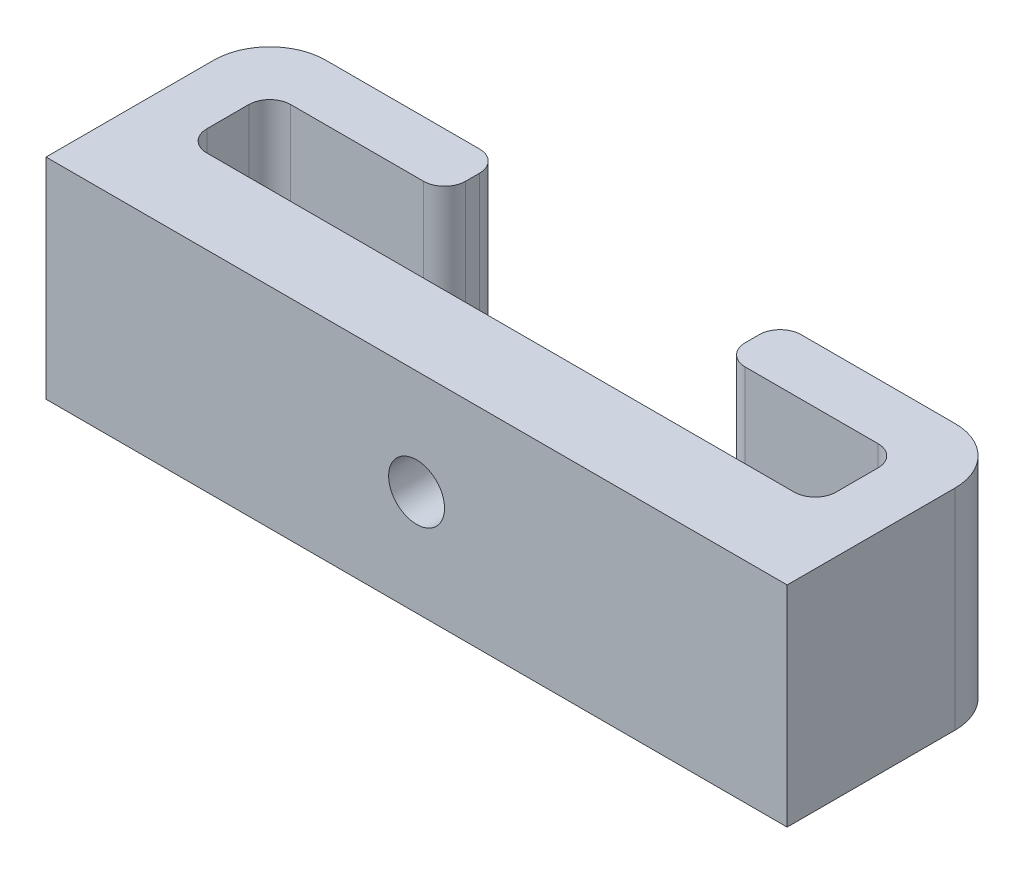
ISO-10303-21;
HEADER;
FILE_DESCRIPTION(('STEP AP214'),'2;1');
FILE_NAME('part.step','',(''),(''),'','','');
FILE_SCHEMA(('AUTOMOTIVE_DESIGN { 1 0 10303 214 1 1 1 1 }'));
ENDSEC;
DATA;
#1=APPLICATION_CONTEXT('core data for automotive mechanical design processes');
#2=APPLICATION_PROTOCOL_DEFINITION('international standard','automotive_design',2000,#1);
#3=PRODUCT_CONTEXT('',#1,'mechanical');
#4=PRODUCT('Part','Part','',(#3));
#5=PRODUCT_RELATED_PRODUCT_CATEGORY('part','',(#4));
#6=PRODUCT_DEFINITION_FORMATION('','',#4);
#7=PRODUCT_DEFINITION_CONTEXT('part definition',#1,'design');
#8=PRODUCT_DEFINITION('design','',#6,#7);
#9=PRODUCT_DEFINITION_SHAPE('','',#8);
#10=(LENGTH_UNIT() NAMED_UNIT(*) SI_UNIT(.MILLI.,.METRE.));
#11=(NAMED_UNIT(*) PLANE_ANGLE_UNIT() SI_UNIT($,.RADIAN.));
#12=(NAMED_UNIT(*) SI_UNIT($,.STERADIAN.) SOLID_ANGLE_UNIT());
#13=UNCERTAINTY_MEASURE_WITH_UNIT(LENGTH_MEASURE(1.E-05),#10,'distance_accuracy_value','');
#14=(GEOMETRIC_REPRESENTATION_CONTEXT(3) GLOBAL_UNCERTAINTY_ASSIGNED_CONTEXT((#13)) GLOBAL_UNIT_ASSIGNED_CONTEXT((#10,
#11,#12)) REPRESENTATION_CONTEXT('',''));
#15=CARTESIAN_POINT('',(0.,0.,0.));
#16=DIRECTION('',(0.,0.,1.));
#17=DIRECTION('',(1.,0.,0.));
#18=AXIS2_PLACEMENT_3D('',#15,#16,#17);
#19=CARTESIAN_POINT('',(-10.,7.5,-6.));
#20=DIRECTION('',(0.,0.,-1.));
#21=DIRECTION('',(-1.,0.,0.));
#22=AXIS2_PLACEMENT_3D('',#19,#20,#21);
#23=PLANE('',#22);
#24=DIRECTION('',(1.,0.,0.));
#25=VECTOR('',#24,1.);
#26=CARTESIAN_POINT('',(-10.,-7.5,-6.));
#27=LINE('',#26,#25);
#28=CARTESIAN_POINT('',(-21.,-7.5,-6.));
#29=VERTEX_POINT('',#28);
#30=CARTESIAN_POINT('',(-11.5,-7.5,-6.));
#31=VERTEX_POINT('',#30);
#32=EDGE_CURVE('E216',#29,#31,#27,.T.);
#33=ORIENTED_EDGE('',*,*,#32,.T.);
#34=DIRECTION('',(0.,-1.,0.));
#35=VECTOR('',#34,1.);
#36=CARTESIAN_POINT('',(-11.5,7.5,-6.));
#37=LINE('',#36,#35);
#38=CARTESIAN_POINT('',(-11.5,7.5,-6.));
#39=VERTEX_POINT('',#38);
#40=EDGE_CURVE('E321',#31,#39,#37,.F.);
#41=ORIENTED_EDGE('',*,*,#40,.T.);
#42=DIRECTION('',(1.,0.,0.));
#43=VECTOR('',#42,1.);
#44=CARTESIAN_POINT('',(-10.,7.5,-6.));
#45=LINE('',#44,#43);
#46=CARTESIAN_POINT('',(-21.,7.5,-6.));
#47=VERTEX_POINT('',#46);
#48=EDGE_CURVE('E217',#47,#39,#45,.T.);
#49=ORIENTED_EDGE('',*,*,#48,.F.);
#50=DIRECTION('',(0.,-1.,0.));
#51=VECTOR('',#50,1.);
#52=CARTESIAN_POINT('',(-21.,-7.5,-6.));
#53=LINE('',#52,#51);
#54=EDGE_CURVE('E318',#47,#29,#53,.T.);
#55=ORIENTED_EDGE('',*,*,#54,.T.);
#56=EDGE_LOOP('',(#33,#41,#49,#55));
#57=FACE_BOUND('',#56,.T.);
#58=ADVANCED_FACE('F33',(#57),#23,.F.);
#59=CARTESIAN_POINT('',(-10.,7.5,-10.));
#60=DIRECTION('',(1.,0.,0.));
#61=DIRECTION('',(0.,0.,-1.));
#62=AXIS2_PLACEMENT_3D('',#59,#60,#61);
#63=PLANE('',#62);
#64=DIRECTION('',(0.,0.,1.));
#65=VECTOR('',#64,1.);
#66=CARTESIAN_POINT('',(-10.,-7.5,-10.));
#67=LINE('',#66,#65);
#68=CARTESIAN_POINT('',(-10.,-7.5,-8.5));
#69=VERTEX_POINT('',#68);
#70=CARTESIAN_POINT('',(-10.,-7.5,-7.5));
#71=VERTEX_POINT('',#70);
#72=EDGE_CURVE('E250',#69,#71,#67,.T.);
#73=ORIENTED_EDGE('',*,*,#72,.F.);
#74=DIRECTION('',(0.,-1.,0.));
#75=VECTOR('',#74,1.);
#76=CARTESIAN_POINT('',(-10.,7.5,-8.5));
#77=LINE('',#76,#75);
#78=CARTESIAN_POINT('',(-10.,7.5,-8.5));
#79=VERTEX_POINT('',#78);
#80=EDGE_CURVE('E316',#69,#79,#77,.F.);
#81=ORIENTED_EDGE('',*,*,#80,.T.);
#82=DIRECTION('',(0.,0.,1.));
#83=VECTOR('',#82,1.);
#84=CARTESIAN_POINT('',(-10.,7.5,-10.));
#85=LINE('',#84,#83);
#86=CARTESIAN_POINT('',(-10.,7.5,-7.5));
#87=VERTEX_POINT('',#86);
#88=EDGE_CURVE('E220',#79,#87,#85,.T.);
#89=ORIENTED_EDGE('',*,*,#88,.T.);
#90=DIRECTION('',(0.,-1.,0.));
#91=VECTOR('',#90,1.);
#92=CARTESIAN_POINT('',(-10.,-7.5,-7.5));
#93=LINE('',#92,#91);
#94=EDGE_CURVE('E313',#87,#71,#93,.T.);
#95=ORIENTED_EDGE('',*,*,#94,.T.);
#96=EDGE_LOOP('',(#73,#81,#89,#95));
#97=FACE_BOUND('',#96,.T.);
#98=ADVANCED_FACE('F421',(#97),#63,.T.);
#99=CARTESIAN_POINT('',(-10.,7.5,-10.));
#100=DIRECTION('',(0.,0.,-1.));
#101=DIRECTION('',(-1.,0.,0.));
#102=AXIS2_PLACEMENT_3D('',#99,#100,#101);
#103=PLANE('',#102);
#104=DIRECTION('',(1.,0.,0.));
#105=VECTOR('',#104,1.);
#106=CARTESIAN_POINT('',(-10.,-7.5,-10.));
#107=LINE('',#106,#105);
#108=CARTESIAN_POINT('',(-22.5,-7.5,-10.));
#109=VERTEX_POINT('',#108);
#110=CARTESIAN_POINT('',(-11.5,-7.5,-10.));
#111=VERTEX_POINT('',#110);
#112=EDGE_CURVE('E193',#109,#111,#107,.T.);
#113=ORIENTED_EDGE('',*,*,#112,.F.);
#114=DIRECTION('',(0.,-1.,0.));
#115=VECTOR('',#114,1.);
#116=CARTESIAN_POINT('',(-22.5,7.5,-10.));
#117=LINE('',#116,#115);
#118=CARTESIAN_POINT('',(-22.5,7.5,-10.));
#119=VERTEX_POINT('',#118);
#120=EDGE_CURVE('E349',#109,#119,#117,.F.);
#121=ORIENTED_EDGE('',*,*,#120,.T.);
#122=DIRECTION('',(1.,0.,0.));
#123=VECTOR('',#122,1.);
#124=CARTESIAN_POINT('',(-10.,7.5,-10.));
#125=LINE('',#124,#123);
#126=CARTESIAN_POINT('',(-11.5,7.5,-10.));
#127=VERTEX_POINT('',#126);
#128=EDGE_CURVE('E224',#119,#127,#125,.T.);
#129=ORIENTED_EDGE('',*,*,#128,.T.);
#130=DIRECTION('',(0.,-1.,0.));
#131=VECTOR('',#130,1.);
#132=CARTESIAN_POINT('',(-11.5,7.5,-10.));
#133=LINE('',#132,#131);
#134=EDGE_CURVE('E310',#127,#111,#133,.T.);
#135=ORIENTED_EDGE('',*,*,#134,.T.);
#136=EDGE_LOOP('',(#113,#121,#129,#135));
#137=FACE_BOUND('',#136,.T.);
#138=ADVANCED_FACE('F431',(#137),#103,.T.);
#139=CARTESIAN_POINT('',(-26.5,7.5,-6.));
#140=DIRECTION('',(-1.,0.,0.));
#141=DIRECTION('',(0.,0.,1.));
#142=AXIS2_PLACEMENT_3D('',#139,#140,#141);
#143=PLANE('',#142);
#144=DIRECTION('',(0.,0.,-1.));
#145=VECTOR('',#144,1.);
#146=CARTESIAN_POINT('',(-26.5,7.5,-6.));
#147=LINE('',#146,#145);
#148=CARTESIAN_POINT('',(-26.5,7.5,6.));
#149=VERTEX_POINT('',#148);
#150=CARTESIAN_POINT('',(-26.5,7.5,-6.));
#151=VERTEX_POINT('',#150);
#152=EDGE_CURVE('E226',#149,#151,#147,.T.);
#153=ORIENTED_EDGE('',*,*,#152,.T.);
#154=DIRECTION('',(0.,-1.,0.));
#155=VECTOR('',#154,1.);
#156=CARTESIAN_POINT('',(-26.5,7.5,-6.));
#157=LINE('',#156,#155);
#158=CARTESIAN_POINT('',(-26.5,-7.5,-6.));
#159=VERTEX_POINT('',#158);
#160=EDGE_CURVE('E190',#151,#159,#157,.T.);
#161=ORIENTED_EDGE('',*,*,#160,.T.);
#162=DIRECTION('',(0.,0.,-1.));
#163=VECTOR('',#162,1.);
#164=CARTESIAN_POINT('',(-26.5,-7.5,-6.));
#165=LINE('',#164,#163);
#166=CARTESIAN_POINT('',(-26.5,-7.5,6.));
#167=VERTEX_POINT('',#166);
#168=EDGE_CURVE('E183',#167,#159,#165,.T.);
#169=ORIENTED_EDGE('',*,*,#168,.F.);
#170=DIRECTION('',(0.,-1.,0.));
#171=VECTOR('',#170,1.);
#172=CARTESIAN_POINT('',(-26.5,7.5,6.));
#173=LINE('',#172,#171);
#174=EDGE_CURVE('E188',#149,#167,#173,.T.);
#175=ORIENTED_EDGE('',*,*,#174,.F.);
#176=EDGE_LOOP('',(#153,#161,#169,#175));
#177=FACE_BOUND('',#176,.T.);
#178=ADVANCED_FACE('F186',(#177),#143,.T.);
#179=CARTESIAN_POINT('',(26.5,7.5,-6.));
#180=DIRECTION('',(1.,0.,0.));
#181=DIRECTION('',(0.,0.,-1.));
#182=AXIS2_PLACEMENT_3D('',#179,#180,#181);
#183=PLANE('',#182);
#184=DIRECTION('',(0.,0.,-1.));
#185=VECTOR('',#184,1.);
#186=CARTESIAN_POINT('',(26.5,-7.5,-6.));
#187=LINE('',#186,#185);
#188=CARTESIAN_POINT('',(26.5,-7.5,-6.));
#189=VERTEX_POINT('',#188);
#190=CARTESIAN_POINT('',(26.5,-7.5,6.));
#191=VERTEX_POINT('',#190);
#192=EDGE_CURVE('E192',#189,#191,#187,.F.);
#193=ORIENTED_EDGE('',*,*,#192,.F.);
#194=DIRECTION('',(0.,-1.,0.));
#195=VECTOR('',#194,1.);
#196=CARTESIAN_POINT('',(26.5,7.5,-6.));
#197=LINE('',#196,#195);
#198=CARTESIAN_POINT('',(26.5,7.5,-6.));
#199=VERTEX_POINT('',#198);
#200=EDGE_CURVE('E11',#189,#199,#197,.F.);
#201=ORIENTED_EDGE('',*,*,#200,.T.);
#202=DIRECTION('',(0.,0.,-1.));
#203=VECTOR('',#202,1.);
#204=CARTESIAN_POINT('',(26.5,7.5,-6.));
#205=LINE('',#204,#203);
#206=CARTESIAN_POINT('',(26.5,7.5,6.));
#207=VERTEX_POINT('',#206);
#208=EDGE_CURVE('E228',#199,#207,#205,.F.);
#209=ORIENTED_EDGE('',*,*,#208,.T.);
#210=DIRECTION('',(0.,1.,0.));
#211=VECTOR('',#210,1.);
#212=CARTESIAN_POINT('',(26.5,-7.5,6.));
#213=LINE('',#212,#211);
#214=EDGE_CURVE('E201',#191,#207,#213,.T.);
#215=ORIENTED_EDGE('',*,*,#214,.F.);
#216=EDGE_LOOP('',(#193,#201,#209,#215));
#217=FACE_BOUND('',#216,.T.);
#218=ADVANCED_FACE('F491',(#217),#183,.T.);
#219=CARTESIAN_POINT('',(10.,7.5,-10.));
#220=DIRECTION('',(0.,0.,-1.));
#221=DIRECTION('',(-1.,0.,0.));
#222=AXIS2_PLACEMENT_3D('',#219,#220,#221);
#223=PLANE('',#222);
#224=DIRECTION('',(1.,0.,0.));
#225=VECTOR('',#224,1.);
#226=CARTESIAN_POINT('',(10.,7.5,-10.));
#227=LINE('',#226,#225);
#228=CARTESIAN_POINT('',(11.5,7.5,-10.));
#229=VERTEX_POINT('',#228);
#230=CARTESIAN_POINT('',(22.5,7.5,-10.));
#231=VERTEX_POINT('',#230);
#232=EDGE_CURVE('E230',#229,#231,#227,.T.);
#233=ORIENTED_EDGE('',*,*,#232,.T.);
#234=DIRECTION('',(0.,-1.,0.));
#235=VECTOR('',#234,1.);
#236=CARTESIAN_POINT('',(22.5,7.5,-10.));
#237=LINE('',#236,#235);
#238=CARTESIAN_POINT('',(22.5,-7.5,-10.));
#239=VERTEX_POINT('',#238);
#240=EDGE_CURVE('E41',#231,#239,#237,.T.);
#241=ORIENTED_EDGE('',*,*,#240,.T.);
#242=DIRECTION('',(1.,0.,0.));
#243=VECTOR('',#242,1.);
#244=CARTESIAN_POINT('',(10.,-7.5,-10.));
#245=LINE('',#244,#243);
#246=CARTESIAN_POINT('',(11.5,-7.5,-10.));
#247=VERTEX_POINT('',#246);
#248=EDGE_CURVE('E255',#247,#239,#245,.T.);
#249=ORIENTED_EDGE('',*,*,#248,.F.);
#250=DIRECTION('',(0.,-1.,0.));
#251=VECTOR('',#250,1.);
#252=CARTESIAN_POINT('',(11.5,7.5,-10.));
#253=LINE('',#252,#251);
#254=EDGE_CURVE('E284',#247,#229,#253,.F.);
#255=ORIENTED_EDGE('',*,*,#254,.T.);
#256=EDGE_LOOP('',(#233,#241,#249,#255));
#257=FACE_BOUND('',#256,.T.);
#258=ADVANCED_FACE('F357',(#257),#223,.T.);
#259=CARTESIAN_POINT('',(10.,7.5,-6.));
#260=DIRECTION('',(-1.,0.,0.));
#261=DIRECTION('',(0.,0.,1.));
#262=AXIS2_PLACEMENT_3D('',#259,#260,#261);
#263=PLANE('',#262);
#264=DIRECTION('',(0.,0.,-1.));
#265=VECTOR('',#264,1.);
#266=CARTESIAN_POINT('',(10.,7.5,-6.));
#267=LINE('',#266,#265);
#268=CARTESIAN_POINT('',(10.,7.5,-7.5));
#269=VERTEX_POINT('',#268);
#270=CARTESIAN_POINT('',(10.,7.5,-8.5));
#271=VERTEX_POINT('',#270);
#272=EDGE_CURVE('E232',#269,#271,#267,.T.);
#273=ORIENTED_EDGE('',*,*,#272,.T.);
#274=DIRECTION('',(0.,-1.,0.));
#275=VECTOR('',#274,1.);
#276=CARTESIAN_POINT('',(10.,7.5,-8.5));
#277=LINE('',#276,#275);
#278=CARTESIAN_POINT('',(10.,-7.5,-8.5));
#279=VERTEX_POINT('',#278);
#280=EDGE_CURVE('E273',#271,#279,#277,.T.);
#281=ORIENTED_EDGE('',*,*,#280,.T.);
#282=DIRECTION('',(0.,0.,-1.));
#283=VECTOR('',#282,1.);
#284=CARTESIAN_POINT('',(10.,-7.5,-6.));
#285=LINE('',#284,#283);
#286=CARTESIAN_POINT('',(10.,-7.5,-7.5));
#287=VERTEX_POINT('',#286);
#288=EDGE_CURVE('E258',#287,#279,#285,.T.);
#289=ORIENTED_EDGE('',*,*,#288,.F.);
#290=DIRECTION('',(0.,-1.,0.));
#291=VECTOR('',#290,1.);
#292=CARTESIAN_POINT('',(10.,7.5,-7.5));
#293=LINE('',#292,#291);
#294=EDGE_CURVE('E247',#287,#269,#293,.F.);
#295=ORIENTED_EDGE('',*,*,#294,.T.);
#296=EDGE_LOOP('',(#273,#281,#289,#295));
#297=FACE_BOUND('',#296,.T.);
#298=ADVANCED_FACE('F366',(#297),#263,.T.);
#299=CARTESIAN_POINT('',(10.,7.5,-6.));
#300=DIRECTION('',(0.,0.,-1.));
#301=DIRECTION('',(-1.,0.,0.));
#302=AXIS2_PLACEMENT_3D('',#299,#300,#301);
#303=PLANE('',#302);
#304=DIRECTION('',(1.,0.,0.));
#305=VECTOR('',#304,1.);
#306=CARTESIAN_POINT('',(10.,-7.5,-6.));
#307=LINE('',#306,#305);
#308=CARTESIAN_POINT('',(11.5,-7.5,-6.));
#309=VERTEX_POINT('',#308);
#310=CARTESIAN_POINT('',(21.,-7.5,-6.));
#311=VERTEX_POINT('',#310);
#312=EDGE_CURVE('E261',#309,#311,#307,.T.);
#313=ORIENTED_EDGE('',*,*,#312,.T.);
#314=DIRECTION('',(0.,-1.,0.));
#315=VECTOR('',#314,1.);
#316=CARTESIAN_POINT('',(21.,7.5,-6.));
#317=LINE('',#316,#315);
#318=CARTESIAN_POINT('',(21.,7.5,-6.));
#319=VERTEX_POINT('',#318);
#320=EDGE_CURVE('E303',#311,#319,#317,.F.);
#321=ORIENTED_EDGE('',*,*,#320,.T.);
#322=DIRECTION('',(1.,0.,0.));
#323=VECTOR('',#322,1.);
#324=CARTESIAN_POINT('',(10.,7.5,-6.));
#325=LINE('',#324,#323);
#326=CARTESIAN_POINT('',(11.5,7.5,-6.));
#327=VERTEX_POINT('',#326);
#328=EDGE_CURVE('E235',#327,#319,#325,.T.);
#329=ORIENTED_EDGE('',*,*,#328,.F.);
#330=DIRECTION('',(0.,-1.,0.));
#331=VECTOR('',#330,1.);
#332=CARTESIAN_POINT('',(11.5,-7.5,-6.));
#333=LINE('',#332,#331);
#334=EDGE_CURVE('E300',#327,#309,#333,.T.);
#335=ORIENTED_EDGE('',*,*,#334,.T.);
#336=EDGE_LOOP('',(#313,#321,#329,#335));
#337=FACE_BOUND('',#336,.T.);
#338=ADVANCED_FACE('F378',(#337),#303,.F.);
#339=CARTESIAN_POINT('',(22.5,7.5,-6.));
#340=DIRECTION('',(1.,0.,0.));
#341=DIRECTION('',(0.,0.,-1.));
#342=AXIS2_PLACEMENT_3D('',#339,#340,#341);
#343=PLANE('',#342);
#344=DIRECTION('',(0.,0.,1.));
#345=VECTOR('',#344,1.);
#346=CARTESIAN_POINT('',(22.5,7.5,-6.));
#347=LINE('',#346,#345);
#348=CARTESIAN_POINT('',(22.5,7.5,-4.5));
#349=VERTEX_POINT('',#348);
#350=CARTESIAN_POINT('',(22.5,7.5,-1.5));
#351=VERTEX_POINT('',#350);
#352=EDGE_CURVE('E238',#349,#351,#347,.T.);
#353=ORIENTED_EDGE('',*,*,#352,.F.);
#354=DIRECTION('',(0.,-1.,0.));
#355=VECTOR('',#354,1.);
#356=CARTESIAN_POINT('',(22.5,-7.5,-4.5));
#357=LINE('',#356,#355);
#358=CARTESIAN_POINT('',(22.5,-7.5,-4.5));
#359=VERTEX_POINT('',#358);
#360=EDGE_CURVE('E297',#349,#359,#357,.T.);
#361=ORIENTED_EDGE('',*,*,#360,.T.);
#362=DIRECTION('',(0.,0.,1.));
#363=VECTOR('',#362,1.);
#364=CARTESIAN_POINT('',(22.5,-7.5,-6.));
#365=LINE('',#364,#363);
#366=CARTESIAN_POINT('',(22.5,-7.5,-1.5));
#367=VERTEX_POINT('',#366);
#368=EDGE_CURVE('E264',#359,#367,#365,.T.);
#369=ORIENTED_EDGE('',*,*,#368,.T.);
#370=DIRECTION('',(0.,-1.,0.));
#371=VECTOR('',#370,1.);
#372=CARTESIAN_POINT('',(22.5,7.5,-1.5));
#373=LINE('',#372,#371);
#374=EDGE_CURVE('E295',#367,#351,#373,.F.);
#375=ORIENTED_EDGE('',*,*,#374,.T.);
#376=EDGE_LOOP('',(#353,#361,#369,#375));
#377=FACE_BOUND('',#376,.T.);
#378=ADVANCED_FACE('F387',(#377),#343,.F.);
#379=CARTESIAN_POINT('',(-22.5,7.5,0.));
#380=DIRECTION('',(0.,0.,1.));
#381=DIRECTION('',(1.,0.,0.));
#382=AXIS2_PLACEMENT_3D('',#379,#380,#381);
#383=PLANE('',#382);
#384=CARTESIAN_POINT('',(0.,0.,0.));
#385=DIRECTION('',(0.,0.,-1.));
#386=DIRECTION('',(-1.,0.,0.));
#387=AXIS2_PLACEMENT_3D('',#384,#385,#386);
#388=CIRCLE('',#387,4.);
#389=CARTESIAN_POINT('',(-4.,0.,0.));
#390=VERTEX_POINT('',#389);
#391=EDGE_CURVE('E655',#390,#390,#388,.T.);
#392=ORIENTED_EDGE('',*,*,#391,.F.);
#393=EDGE_LOOP('',(#392));
#394=FACE_BOUND('',#393,.T.);
#395=DIRECTION('',(-1.,0.,0.));
#396=VECTOR('',#395,1.);
#397=CARTESIAN_POINT('',(-22.5,7.5,0.));
#398=LINE('',#397,#396);
#399=CARTESIAN_POINT('',(21.,7.5,0.));
#400=VERTEX_POINT('',#399);
#401=CARTESIAN_POINT('',(-21.,7.5,0.));
#402=VERTEX_POINT('',#401);
#403=EDGE_CURVE('E241',#400,#402,#398,.T.);
#404=ORIENTED_EDGE('',*,*,#403,.F.);
#405=DIRECTION('',(0.,-1.,0.));
#406=VECTOR('',#405,1.);
#407=CARTESIAN_POINT('',(21.,-7.5,0.));
#408=LINE('',#407,#406);
#409=CARTESIAN_POINT('',(21.,-7.5,0.));
#410=VERTEX_POINT('',#409);
#411=EDGE_CURVE('E307',#400,#410,#408,.T.);
#412=ORIENTED_EDGE('',*,*,#411,.T.);
#413=DIRECTION('',(-1.,0.,0.));
#414=VECTOR('',#413,1.);
#415=CARTESIAN_POINT('',(-22.5,-7.5,0.));
#416=LINE('',#415,#414);
#417=CARTESIAN_POINT('',(-21.,-7.5,0.));
#418=VERTEX_POINT('',#417);
#419=EDGE_CURVE('E267',#410,#418,#416,.T.);
#420=ORIENTED_EDGE('',*,*,#419,.T.);
#421=DIRECTION('',(0.,-1.,0.));
#422=VECTOR('',#421,1.);
#423=CARTESIAN_POINT('',(-21.,7.5,0.));
#424=LINE('',#423,#422);
#425=EDGE_CURVE('E305',#418,#402,#424,.F.);
#426=ORIENTED_EDGE('',*,*,#425,.T.);
#427=EDGE_LOOP('',(#404,#412,#420,#426));
#428=FACE_BOUND('',#427,.T.);
#429=ADVANCED_FACE('F396',(#394,#428),#383,.F.);
#430=CARTESIAN_POINT('',(-22.5,7.5,-6.));
#431=DIRECTION('',(-1.,0.,0.));
#432=DIRECTION('',(0.,0.,1.));
#433=AXIS2_PLACEMENT_3D('',#430,#431,#432);
#434=PLANE('',#433);
#435=DIRECTION('',(0.,0.,-1.));
#436=VECTOR('',#435,1.);
#437=CARTESIAN_POINT('',(-22.5,-7.5,-6.));
#438=LINE('',#437,#436);
#439=CARTESIAN_POINT('',(-22.5,-7.5,-1.5));
#440=VERTEX_POINT('',#439);
#441=CARTESIAN_POINT('',(-22.5,-7.5,-4.5));
#442=VERTEX_POINT('',#441);
#443=EDGE_CURVE('E221',#440,#442,#438,.T.);
#444=ORIENTED_EDGE('',*,*,#443,.T.);
#445=DIRECTION('',(0.,-1.,0.));
#446=VECTOR('',#445,1.);
#447=CARTESIAN_POINT('',(-22.5,7.5,-4.5));
#448=LINE('',#447,#446);
#449=CARTESIAN_POINT('',(-22.5,7.5,-4.5));
#450=VERTEX_POINT('',#449);
#451=EDGE_CURVE('E326',#442,#450,#448,.F.);
#452=ORIENTED_EDGE('',*,*,#451,.T.);
#453=DIRECTION('',(0.,0.,-1.));
#454=VECTOR('',#453,1.);
#455=CARTESIAN_POINT('',(-22.5,7.5,-6.));
#456=LINE('',#455,#454);
#457=CARTESIAN_POINT('',(-22.5,7.5,-1.5));
#458=VERTEX_POINT('',#457);
#459=EDGE_CURVE('E244',#458,#450,#456,.T.);
#460=ORIENTED_EDGE('',*,*,#459,.F.);
#461=DIRECTION('',(0.,-1.,0.));
#462=VECTOR('',#461,1.);
#463=CARTESIAN_POINT('',(-22.5,-7.5,-1.5));
#464=LINE('',#463,#462);
#465=EDGE_CURVE('E323',#458,#440,#464,.T.);
#466=ORIENTED_EDGE('',*,*,#465,.T.);
#467=EDGE_LOOP('',(#444,#452,#460,#466));
#468=FACE_BOUND('',#467,.T.);
#469=ADVANCED_FACE('F405',(#468),#434,.F.);
#470=CARTESIAN_POINT('',(0.,7.5,0.));
#471=DIRECTION('',(0.,-1.,0.));
#472=DIRECTION('',(-1.,0.,0.));
#473=AXIS2_PLACEMENT_3D('',#470,#471,#472);
#474=PLANE('',#473);
#475=ORIENTED_EDGE('',*,*,#128,.F.);
#476=CARTESIAN_POINT('',(-22.5,7.5,-6.));
#477=DIRECTION('',(0.,-1.,0.));
#478=DIRECTION('',(0.,0.,-1.));
#479=AXIS2_PLACEMENT_3D('',#476,#477,#478);
#480=CIRCLE('',#479,4.);
#481=EDGE_CURVE('E352',#119,#151,#480,.F.);
#482=ORIENTED_EDGE('',*,*,#481,.T.);
#483=ORIENTED_EDGE('',*,*,#152,.F.);
#484=DIRECTION('',(-1.,0.,0.));
#485=VECTOR('',#484,1.);
#486=CARTESIAN_POINT('',(26.5,7.5,6.));
#487=LINE('',#486,#485);
#488=EDGE_CURVE('E206',#207,#149,#487,.T.);
#489=ORIENTED_EDGE('',*,*,#488,.F.);
#490=ORIENTED_EDGE('',*,*,#208,.F.);
#491=CARTESIAN_POINT('',(22.5,7.5,-6.));
#492=DIRECTION('',(0.,-1.,0.));
#493=DIRECTION('',(0.,0.,-1.));
#494=AXIS2_PLACEMENT_3D('',#491,#492,#493);
#495=CIRCLE('',#494,4.);
#496=EDGE_CURVE('E53',#199,#231,#495,.F.);
#497=ORIENTED_EDGE('',*,*,#496,.T.);
#498=ORIENTED_EDGE('',*,*,#232,.F.);
#499=CARTESIAN_POINT('',(11.5,7.5,-8.5));
#500=DIRECTION('',(0.,-1.,0.));
#501=DIRECTION('',(0.,0.,-1.));
#502=AXIS2_PLACEMENT_3D('',#499,#500,#501);
#503=CIRCLE('',#502,1.5);
#504=EDGE_CURVE('E293',#229,#271,#503,.F.);
#505=ORIENTED_EDGE('',*,*,#504,.T.);
#506=ORIENTED_EDGE('',*,*,#272,.F.);
#507=CARTESIAN_POINT('',(11.5,7.5,-7.5));
#508=DIRECTION('',(0.,-1.,0.));
#509=DIRECTION('',(0.,0.,-1.));
#510=AXIS2_PLACEMENT_3D('',#507,#508,#509);
#511=CIRCLE('',#510,1.5);
#512=EDGE_CURVE('E291',#269,#327,#511,.F.);
#513=ORIENTED_EDGE('',*,*,#512,.T.);
#514=ORIENTED_EDGE('',*,*,#328,.T.);
#515=CARTESIAN_POINT('',(21.,7.5,-4.5));
#516=DIRECTION('',(0.,-1.,0.));
#517=DIRECTION('',(0.,0.,-1.));
#518=AXIS2_PLACEMENT_3D('',#515,#516,#517);
#519=CIRCLE('',#518,1.5);
#520=EDGE_CURVE('E330',#319,#349,#519,.T.);
#521=ORIENTED_EDGE('',*,*,#520,.T.);
#522=ORIENTED_EDGE('',*,*,#352,.T.);
#523=CARTESIAN_POINT('',(21.,7.5,-1.5));
#524=DIRECTION('',(0.,-1.,0.));
#525=DIRECTION('',(0.,0.,-1.));
#526=AXIS2_PLACEMENT_3D('',#523,#524,#525);
#527=CIRCLE('',#526,1.5);
#528=EDGE_CURVE('E334',#351,#400,#527,.T.);
#529=ORIENTED_EDGE('',*,*,#528,.T.);
#530=ORIENTED_EDGE('',*,*,#403,.T.);
#531=CARTESIAN_POINT('',(-21.,7.5,-1.5));
#532=DIRECTION('',(0.,-1.,0.));
#533=DIRECTION('',(0.,0.,-1.));
#534=AXIS2_PLACEMENT_3D('',#531,#532,#533);
#535=CIRCLE('',#534,1.5);
#536=EDGE_CURVE('E342',#402,#458,#535,.T.);
#537=ORIENTED_EDGE('',*,*,#536,.T.);
#538=ORIENTED_EDGE('',*,*,#459,.T.);
#539=CARTESIAN_POINT('',(-21.,7.5,-4.5));
#540=DIRECTION('',(0.,-1.,0.));
#541=DIRECTION('',(0.,0.,-1.));
#542=AXIS2_PLACEMENT_3D('',#539,#540,#541);
#543=CIRCLE('',#542,1.5);
#544=EDGE_CURVE('E338',#450,#47,#543,.T.);
#545=ORIENTED_EDGE('',*,*,#544,.T.);
#546=ORIENTED_EDGE('',*,*,#48,.T.);
#547=CARTESIAN_POINT('',(-11.5,7.5,-7.5));
#548=DIRECTION('',(0.,-1.,0.));
#549=DIRECTION('',(0.,0.,-1.));
#550=AXIS2_PLACEMENT_3D('',#547,#548,#549);
#551=CIRCLE('',#550,1.5);
#552=EDGE_CURVE('E286',#39,#87,#551,.F.);
#553=ORIENTED_EDGE('',*,*,#552,.T.);
#554=ORIENTED_EDGE('',*,*,#88,.F.);
#555=CARTESIAN_POINT('',(-11.5,7.5,-8.5));
#556=DIRECTION('',(0.,-1.,0.));
#557=DIRECTION('',(0.,0.,-1.));
#558=AXIS2_PLACEMENT_3D('',#555,#556,#557);
#559=CIRCLE('',#558,1.5);
#560=EDGE_CURVE('E288',#79,#127,#559,.F.);
#561=ORIENTED_EDGE('',*,*,#560,.T.);
#562=EDGE_LOOP('',(#475,#482,#483,#489,#490,#497,#498,#505,#506,#513,#514,#521,#522,#529,#530,
#537,#538,#545,#546,#553,#554,#561));
#563=FACE_BOUND('',#562,.T.);
#564=ADVANCED_FACE('F371',(#563),#474,.F.);
#565=CARTESIAN_POINT('',(0.,-7.5,0.));
#566=DIRECTION('',(0.,-1.,0.));
#567=DIRECTION('',(-1.,0.,0.));
#568=AXIS2_PLACEMENT_3D('',#565,#566,#567);
#569=PLANE('',#568);
#570=ORIENTED_EDGE('',*,*,#168,.T.);
#571=CARTESIAN_POINT('',(-22.5,-7.5,-6.));
#572=DIRECTION('',(0.,-1.,0.));
#573=DIRECTION('',(0.,0.,-1.));
#574=AXIS2_PLACEMENT_3D('',#571,#572,#573);
#575=CIRCLE('',#574,4.);
#576=EDGE_CURVE('E347',#159,#109,#575,.T.);
#577=ORIENTED_EDGE('',*,*,#576,.T.);
#578=ORIENTED_EDGE('',*,*,#112,.T.);
#579=CARTESIAN_POINT('',(-11.5,-7.5,-8.5));
#580=DIRECTION('',(0.,-1.,0.));
#581=DIRECTION('',(0.,0.,-1.));
#582=AXIS2_PLACEMENT_3D('',#579,#580,#581);
#583=CIRCLE('',#582,1.5);
#584=EDGE_CURVE('E278',#111,#69,#583,.T.);
#585=ORIENTED_EDGE('',*,*,#584,.T.);
#586=ORIENTED_EDGE('',*,*,#72,.T.);
#587=CARTESIAN_POINT('',(-11.5,-7.5,-7.5));
#588=DIRECTION('',(0.,-1.,0.));
#589=DIRECTION('',(0.,0.,-1.));
#590=AXIS2_PLACEMENT_3D('',#587,#588,#589);
#591=CIRCLE('',#590,1.5);
#592=EDGE_CURVE('E276',#71,#31,#591,.T.);
#593=ORIENTED_EDGE('',*,*,#592,.T.);
#594=ORIENTED_EDGE('',*,*,#32,.F.);
#595=CARTESIAN_POINT('',(-21.,-7.5,-4.5));
#596=DIRECTION('',(0.,-1.,0.));
#597=DIRECTION('',(0.,0.,-1.));
#598=AXIS2_PLACEMENT_3D('',#595,#596,#597);
#599=CIRCLE('',#598,1.5);
#600=EDGE_CURVE('E336',#29,#442,#599,.F.);
#601=ORIENTED_EDGE('',*,*,#600,.T.);
#602=ORIENTED_EDGE('',*,*,#443,.F.);
#603=CARTESIAN_POINT('',(-21.,-7.5,-1.5));
#604=DIRECTION('',(0.,-1.,0.));
#605=DIRECTION('',(0.,0.,-1.));
#606=AXIS2_PLACEMENT_3D('',#603,#604,#605);
#607=CIRCLE('',#606,1.5);
#608=EDGE_CURVE('E340',#440,#418,#607,.F.);
#609=ORIENTED_EDGE('',*,*,#608,.T.);
#610=ORIENTED_EDGE('',*,*,#419,.F.);
#611=CARTESIAN_POINT('',(21.,-7.5,-1.5));
#612=DIRECTION('',(0.,-1.,0.));
#613=DIRECTION('',(0.,0.,-1.));
#614=AXIS2_PLACEMENT_3D('',#611,#612,#613);
#615=CIRCLE('',#614,1.5);
#616=EDGE_CURVE('E332',#410,#367,#615,.F.);
#617=ORIENTED_EDGE('',*,*,#616,.T.);
#618=ORIENTED_EDGE('',*,*,#368,.F.);
#619=CARTESIAN_POINT('',(21.,-7.5,-4.5));
#620=DIRECTION('',(0.,-1.,0.));
#621=DIRECTION('',(0.,0.,-1.));
#622=AXIS2_PLACEMENT_3D('',#619,#620,#621);
#623=CIRCLE('',#622,1.5);
#624=EDGE_CURVE('E328',#359,#311,#623,.F.);
#625=ORIENTED_EDGE('',*,*,#624,.T.);
#626=ORIENTED_EDGE('',*,*,#312,.F.);
#627=CARTESIAN_POINT('',(11.5,-7.5,-7.5));
#628=DIRECTION('',(0.,-1.,0.));
#629=DIRECTION('',(0.,0.,-1.));
#630=AXIS2_PLACEMENT_3D('',#627,#628,#629);
#631=CIRCLE('',#630,1.5);
#632=EDGE_CURVE('E280',#309,#287,#631,.T.);
#633=ORIENTED_EDGE('',*,*,#632,.T.);
#634=ORIENTED_EDGE('',*,*,#288,.T.);
#635=CARTESIAN_POINT('',(11.5,-7.5,-8.5));
#636=DIRECTION('',(0.,-1.,0.));
#637=DIRECTION('',(0.,0.,-1.));
#638=AXIS2_PLACEMENT_3D('',#635,#636,#637);
#639=CIRCLE('',#638,1.5);
#640=EDGE_CURVE('E282',#279,#247,#639,.T.);
#641=ORIENTED_EDGE('',*,*,#640,.T.);
#642=ORIENTED_EDGE('',*,*,#248,.T.);
#643=CARTESIAN_POINT('',(22.5,-7.5,-6.));
#644=DIRECTION('',(0.,-1.,0.));
#645=DIRECTION('',(0.,0.,-1.));
#646=AXIS2_PLACEMENT_3D('',#643,#644,#645);
#647=CIRCLE('',#646,4.);
#648=EDGE_CURVE('E345',#239,#189,#647,.T.);
#649=ORIENTED_EDGE('',*,*,#648,.T.);
#650=ORIENTED_EDGE('',*,*,#192,.T.);
#651=DIRECTION('',(1.,0.,0.));
#652=VECTOR('',#651,1.);
#653=CARTESIAN_POINT('',(-26.5,-7.5,6.));
#654=LINE('',#653,#652);
#655=EDGE_CURVE('E196',#167,#191,#654,.T.);
#656=ORIENTED_EDGE('',*,*,#655,.F.);
#657=EDGE_LOOP('',(#570,#577,#578,#585,#586,#593,#594,#601,#602,#609,#610,#617,#618,#625,#626,
#633,#634,#641,#642,#649,#650,#656));
#658=FACE_BOUND('',#657,.T.);
#659=ADVANCED_FACE('F197',(#658),#569,.T.);
#660=CARTESIAN_POINT('',(0.,0.,6.));
#661=DIRECTION('',(0.,0.,1.));
#662=DIRECTION('',(1.,0.,0.));
#663=AXIS2_PLACEMENT_3D('',#660,#661,#662);
#664=PLANE('',#663);
#665=CARTESIAN_POINT('',(0.,0.,6.));
#666=DIRECTION('',(0.,0.,-1.));
#667=DIRECTION('',(-1.,0.,0.));
#668=AXIS2_PLACEMENT_3D('',#665,#666,#667);
#669=CIRCLE('',#668,2.);
#670=CARTESIAN_POINT('',(-2.,0.,6.));
#671=VERTEX_POINT('',#670);
#672=EDGE_CURVE('E207',#671,#671,#669,.T.);
#673=ORIENTED_EDGE('',*,*,#672,.T.);
#674=EDGE_LOOP('',(#673));
#675=FACE_BOUND('',#674,.T.);
#676=ORIENTED_EDGE('',*,*,#174,.T.);
#677=ORIENTED_EDGE('',*,*,#655,.T.);
#678=ORIENTED_EDGE('',*,*,#214,.T.);
#679=ORIENTED_EDGE('',*,*,#488,.T.);
#680=EDGE_LOOP('',(#676,#677,#678,#679));
#681=FACE_BOUND('',#680,.T.);
#682=ADVANCED_FACE('F204',(#675,#681),#664,.T.);
#683=CARTESIAN_POINT('',(0.,0.,0.));
#684=DIRECTION('',(0.,0.,-1.));
#685=DIRECTION('',(-1.,0.,0.));
#686=AXIS2_PLACEMENT_3D('',#683,#684,#685);
#687=CYLINDRICAL_SURFACE('',#686,2.);
#688=ORIENTED_EDGE('',*,*,#672,.F.);
#689=EDGE_LOOP('',(#688));
#690=FACE_BOUND('',#689,.T.);
#691=CARTESIAN_POINT('',(0.,0.,2.));
#692=DIRECTION('',(0.,0.,-1.));
#693=DIRECTION('',(-1.,0.,0.));
#694=AXIS2_PLACEMENT_3D('',#691,#692,#693);
#695=CIRCLE('',#694,2.);
#696=CARTESIAN_POINT('',(-2.,0.,2.));
#697=VERTEX_POINT('',#696);
#698=EDGE_CURVE('E210',#697,#697,#695,.T.);
#699=ORIENTED_EDGE('',*,*,#698,.T.);
#700=EDGE_LOOP('',(#699));
#701=FACE_BOUND('',#700,.T.);
#702=ADVANCED_FACE('F547',(#690,#701),#687,.F.);
#703=CARTESIAN_POINT('',(0.,0.,0.));
#704=DIRECTION('',(0.,0.,-1.));
#705=DIRECTION('',(-1.,0.,0.));
#706=AXIS2_PLACEMENT_3D('',#703,#704,#705);
#707=CONICAL_SURFACE('',#706,4.,0.785398163397449);
#708=ORIENTED_EDGE('',*,*,#698,.F.);
#709=EDGE_LOOP('',(#708));
#710=FACE_BOUND('',#709,.T.);
#711=ORIENTED_EDGE('',*,*,#391,.T.);
#712=EDGE_LOOP('',(#711));
#713=FACE_BOUND('',#712,.T.);
#714=ADVANCED_FACE('F452',(#710,#713),#707,.F.);
#715=CARTESIAN_POINT('',(11.5,7.5,-8.5));
#716=DIRECTION('',(0.,-1.,0.));
#717=DIRECTION('',(0.,0.,-1.));
#718=AXIS2_PLACEMENT_3D('',#715,#716,#717);
#719=CYLINDRICAL_SURFACE('',#718,1.5);
#720=ORIENTED_EDGE('',*,*,#504,.F.);
#721=ORIENTED_EDGE('',*,*,#254,.F.);
#722=ORIENTED_EDGE('',*,*,#640,.F.);
#723=ORIENTED_EDGE('',*,*,#280,.F.);
#724=EDGE_LOOP('',(#720,#721,#722,#723));
#725=FACE_BOUND('',#724,.T.);
#726=ADVANCED_FACE('F364',(#725),#719,.T.);
#727=CARTESIAN_POINT('',(21.,7.5,-4.5));
#728=DIRECTION('',(0.,1.,0.));
#729=DIRECTION('',(0.,0.,1.));
#730=AXIS2_PLACEMENT_3D('',#727,#728,#729);
#731=CYLINDRICAL_SURFACE('',#730,1.5);
#732=ORIENTED_EDGE('',*,*,#520,.F.);
#733=ORIENTED_EDGE('',*,*,#320,.F.);
#734=ORIENTED_EDGE('',*,*,#624,.F.);
#735=ORIENTED_EDGE('',*,*,#360,.F.);
#736=EDGE_LOOP('',(#732,#733,#734,#735));
#737=FACE_BOUND('',#736,.T.);
#738=ADVANCED_FACE('F384',(#737),#731,.F.);
#739=CARTESIAN_POINT('',(21.,7.5,-1.5));
#740=DIRECTION('',(0.,1.,0.));
#741=DIRECTION('',(0.,0.,1.));
#742=AXIS2_PLACEMENT_3D('',#739,#740,#741);
#743=CYLINDRICAL_SURFACE('',#742,1.5);
#744=ORIENTED_EDGE('',*,*,#528,.F.);
#745=ORIENTED_EDGE('',*,*,#374,.F.);
#746=ORIENTED_EDGE('',*,*,#616,.F.);
#747=ORIENTED_EDGE('',*,*,#411,.F.);
#748=EDGE_LOOP('',(#744,#745,#746,#747));
#749=FACE_BOUND('',#748,.T.);
#750=ADVANCED_FACE('F393',(#749),#743,.F.);
#751=CARTESIAN_POINT('',(11.5,7.5,-7.5));
#752=DIRECTION('',(0.,1.,0.));
#753=DIRECTION('',(0.,0.,1.));
#754=AXIS2_PLACEMENT_3D('',#751,#752,#753);
#755=CYLINDRICAL_SURFACE('',#754,1.5);
#756=ORIENTED_EDGE('',*,*,#512,.F.);
#757=ORIENTED_EDGE('',*,*,#294,.F.);
#758=ORIENTED_EDGE('',*,*,#632,.F.);
#759=ORIENTED_EDGE('',*,*,#334,.F.);
#760=EDGE_LOOP('',(#756,#757,#758,#759));
#761=FACE_BOUND('',#760,.T.);
#762=ADVANCED_FACE('F375',(#761),#755,.T.);
#763=CARTESIAN_POINT('',(-11.5,7.5,-8.5));
#764=DIRECTION('',(0.,-1.,0.));
#765=DIRECTION('',(0.,0.,-1.));
#766=AXIS2_PLACEMENT_3D('',#763,#764,#765);
#767=CYLINDRICAL_SURFACE('',#766,1.5);
#768=ORIENTED_EDGE('',*,*,#560,.F.);
#769=ORIENTED_EDGE('',*,*,#80,.F.);
#770=ORIENTED_EDGE('',*,*,#584,.F.);
#771=ORIENTED_EDGE('',*,*,#134,.F.);
#772=EDGE_LOOP('',(#768,#769,#770,#771));
#773=FACE_BOUND('',#772,.T.);
#774=ADVANCED_FACE('F427',(#773),#767,.T.);
#775=CARTESIAN_POINT('',(-11.5,7.5,-7.5));
#776=DIRECTION('',(0.,1.,0.));
#777=DIRECTION('',(0.,0.,1.));
#778=AXIS2_PLACEMENT_3D('',#775,#776,#777);
#779=CYLINDRICAL_SURFACE('',#778,1.5);
#780=ORIENTED_EDGE('',*,*,#552,.F.);
#781=ORIENTED_EDGE('',*,*,#40,.F.);
#782=ORIENTED_EDGE('',*,*,#592,.F.);
#783=ORIENTED_EDGE('',*,*,#94,.F.);
#784=EDGE_LOOP('',(#780,#781,#782,#783));
#785=FACE_BOUND('',#784,.T.);
#786=ADVANCED_FACE('F419',(#785),#779,.T.);
#787=CARTESIAN_POINT('',(-21.,7.5,-4.5));
#788=DIRECTION('',(0.,1.,0.));
#789=DIRECTION('',(0.,0.,1.));
#790=AXIS2_PLACEMENT_3D('',#787,#788,#789);
#791=CYLINDRICAL_SURFACE('',#790,1.5);
#792=ORIENTED_EDGE('',*,*,#544,.F.);
#793=ORIENTED_EDGE('',*,*,#451,.F.);
#794=ORIENTED_EDGE('',*,*,#600,.F.);
#795=ORIENTED_EDGE('',*,*,#54,.F.);
#796=EDGE_LOOP('',(#792,#793,#794,#795));
#797=FACE_BOUND('',#796,.T.);
#798=ADVANCED_FACE('F411',(#797),#791,.F.);
#799=CARTESIAN_POINT('',(-21.,7.5,-1.5));
#800=DIRECTION('',(0.,1.,0.));
#801=DIRECTION('',(0.,0.,1.));
#802=AXIS2_PLACEMENT_3D('',#799,#800,#801);
#803=CYLINDRICAL_SURFACE('',#802,1.5);
#804=ORIENTED_EDGE('',*,*,#536,.F.);
#805=ORIENTED_EDGE('',*,*,#425,.F.);
#806=ORIENTED_EDGE('',*,*,#608,.F.);
#807=ORIENTED_EDGE('',*,*,#465,.F.);
#808=EDGE_LOOP('',(#804,#805,#806,#807));
#809=FACE_BOUND('',#808,.T.);
#810=ADVANCED_FACE('F402',(#809),#803,.F.);
#811=CARTESIAN_POINT('',(-22.5,7.5,-6.));
#812=DIRECTION('',(0.,-1.,0.));
#813=DIRECTION('',(0.,0.,-1.));
#814=AXIS2_PLACEMENT_3D('',#811,#812,#813);
#815=CYLINDRICAL_SURFACE('',#814,4.);
#816=ORIENTED_EDGE('',*,*,#481,.F.);
#817=ORIENTED_EDGE('',*,*,#120,.F.);
#818=ORIENTED_EDGE('',*,*,#576,.F.);
#819=ORIENTED_EDGE('',*,*,#160,.F.);
#820=EDGE_LOOP('',(#816,#817,#818,#819));
#821=FACE_BOUND('',#820,.T.);
#822=ADVANCED_FACE('F435',(#821),#815,.T.);
#823=CARTESIAN_POINT('',(22.5,7.5,-6.));
#824=DIRECTION('',(0.,-1.,0.));
#825=DIRECTION('',(0.,0.,-1.));
#826=AXIS2_PLACEMENT_3D('',#823,#824,#825);
#827=CYLINDRICAL_SURFACE('',#826,4.);
#828=ORIENTED_EDGE('',*,*,#496,.F.);
#829=ORIENTED_EDGE('',*,*,#200,.F.);
#830=ORIENTED_EDGE('',*,*,#648,.F.);
#831=ORIENTED_EDGE('',*,*,#240,.F.);
#832=EDGE_LOOP('',(#828,#829,#830,#831));
#833=FACE_BOUND('',#832,.T.);
#834=ADVANCED_FACE('F35',(#833),#827,.T.);
#835=CLOSED_SHELL('',(#58,#98,#138,#178,#218,#258,#298,#338,#378,#429,#469,#564,#659,#682,#702,
#714,#726,#738,#750,#762,#774,#786,#798,#810,#822,#834));
#836=MANIFOLD_SOLID_BREP('B2',#835);
#837=ADVANCED_BREP_SHAPE_REPRESENTATION('',(#18,#836),#14);
#838=SHAPE_DEFINITION_REPRESENTATION(#9,#837);
ENDSEC;
END-ISO-10303-21;
